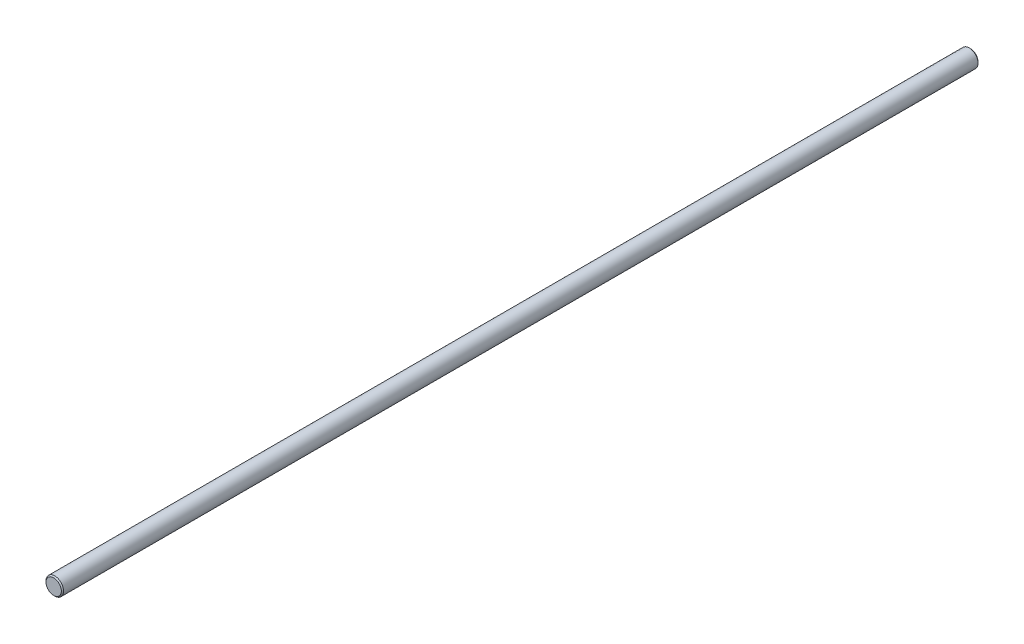
ISO-10303-21;
HEADER;
FILE_DESCRIPTION(('STEP AP214'),'2;1');
FILE_NAME('part.step','',(''),(''),'','','');
FILE_SCHEMA(('AUTOMOTIVE_DESIGN { 1 0 10303 214 1 1 1 1 }'));
ENDSEC;
DATA;
#1=APPLICATION_CONTEXT('core data for automotive mechanical design processes');
#2=APPLICATION_PROTOCOL_DEFINITION('international standard','automotive_design',2000,#1);
#3=PRODUCT_CONTEXT('',#1,'mechanical');
#4=PRODUCT('Part','Part','',(#3));
#5=PRODUCT_RELATED_PRODUCT_CATEGORY('part','',(#4));
#6=PRODUCT_DEFINITION_FORMATION('','',#4);
#7=PRODUCT_DEFINITION_CONTEXT('part definition',#1,'design');
#8=PRODUCT_DEFINITION('design','',#6,#7);
#9=PRODUCT_DEFINITION_SHAPE('','',#8);
#10=(LENGTH_UNIT() NAMED_UNIT(*) SI_UNIT(.MILLI.,.METRE.));
#11=(NAMED_UNIT(*) PLANE_ANGLE_UNIT() SI_UNIT($,.RADIAN.));
#12=(NAMED_UNIT(*) SI_UNIT($,.STERADIAN.) SOLID_ANGLE_UNIT());
#13=UNCERTAINTY_MEASURE_WITH_UNIT(LENGTH_MEASURE(1.E-05),#10,'distance_accuracy_value','');
#14=(GEOMETRIC_REPRESENTATION_CONTEXT(3) GLOBAL_UNCERTAINTY_ASSIGNED_CONTEXT((#13)) GLOBAL_UNIT_ASSIGNED_CONTEXT((#10,
#11,#12)) REPRESENTATION_CONTEXT('',''));
#15=CARTESIAN_POINT('',(0.,0.,0.));
#16=DIRECTION('',(0.,0.,1.));
#17=DIRECTION('',(1.,0.,0.));
#18=AXIS2_PLACEMENT_3D('',#15,#16,#17);
#19=CARTESIAN_POINT('',(0.,0.,417.5));
#20=DIRECTION('',(0.,0.,-1.));
#21=DIRECTION('',(-1.,0.,0.));
#22=AXIS2_PLACEMENT_3D('',#19,#20,#21);
#23=CONICAL_SURFACE('',#22,4.,0.785398163397448);
#24=CARTESIAN_POINT('',(0.,0.,418.));
#25=DIRECTION('',(0.,0.,-1.));
#26=DIRECTION('',(-1.,0.,0.));
#27=AXIS2_PLACEMENT_3D('',#24,#25,#26);
#28=CIRCLE('',#27,3.5);
#29=CARTESIAN_POINT('',(-3.5,0.,418.));
#30=VERTEX_POINT('',#29);
#31=EDGE_CURVE('E42',#30,#30,#28,.T.);
#32=ORIENTED_EDGE('',*,*,#31,.T.);
#33=EDGE_LOOP('',(#32));
#34=FACE_BOUND('',#33,.T.);
#35=CARTESIAN_POINT('',(0.,0.,417.5));
#36=DIRECTION('',(0.,0.,-1.));
#37=DIRECTION('',(-1.,0.,0.));
#38=AXIS2_PLACEMENT_3D('',#35,#36,#37);
#39=CIRCLE('',#38,4.);
#40=CARTESIAN_POINT('',(-4.,0.,417.5));
#41=VERTEX_POINT('',#40);
#42=EDGE_CURVE('E10',#41,#41,#39,.T.);
#43=ORIENTED_EDGE('',*,*,#42,.F.);
#44=EDGE_LOOP('',(#43));
#45=FACE_BOUND('',#44,.T.);
#46=ADVANCED_FACE('F28',(#34,#45),#23,.T.);
#47=CARTESIAN_POINT('',(0.,0.,418.));
#48=DIRECTION('',(0.,0.,-1.));
#49=DIRECTION('',(-1.,0.,0.));
#50=AXIS2_PLACEMENT_3D('',#47,#48,#49);
#51=CYLINDRICAL_SURFACE('',#50,4.);
#52=ORIENTED_EDGE('',*,*,#42,.T.);
#53=EDGE_LOOP('',(#52));
#54=FACE_BOUND('',#53,.T.);
#55=CARTESIAN_POINT('',(0.,0.,0.5));
#56=DIRECTION('',(0.,0.,-1.));
#57=DIRECTION('',(-1.,0.,0.));
#58=AXIS2_PLACEMENT_3D('',#55,#56,#57);
#59=CIRCLE('',#58,4.);
#60=CARTESIAN_POINT('',(-4.,0.,0.5));
#61=VERTEX_POINT('',#60);
#62=EDGE_CURVE('E34',#61,#61,#59,.T.);
#63=ORIENTED_EDGE('',*,*,#62,.F.);
#64=EDGE_LOOP('',(#63));
#65=FACE_BOUND('',#64,.T.);
#66=ADVANCED_FACE('F61',(#54,#65),#51,.T.);
#67=CARTESIAN_POINT('',(0.,0.,0.));
#68=DIRECTION('',(0.,0.,1.));
#69=DIRECTION('',(1.,0.,0.));
#70=AXIS2_PLACEMENT_3D('',#67,#68,#69);
#71=CONICAL_SURFACE('',#70,3.5,0.785398163397448);
#72=ORIENTED_EDGE('',*,*,#62,.T.);
#73=EDGE_LOOP('',(#72));
#74=FACE_BOUND('',#73,.T.);
#75=CARTESIAN_POINT('',(0.,0.,0.));
#76=DIRECTION('',(0.,0.,-1.));
#77=DIRECTION('',(-1.,0.,0.));
#78=AXIS2_PLACEMENT_3D('',#75,#76,#77);
#79=CIRCLE('',#78,3.5);
#80=CARTESIAN_POINT('',(-3.5,0.,0.));
#81=VERTEX_POINT('',#80);
#82=EDGE_CURVE('E38',#81,#81,#79,.T.);
#83=ORIENTED_EDGE('',*,*,#82,.F.);
#84=EDGE_LOOP('',(#83));
#85=FACE_BOUND('',#84,.T.);
#86=ADVANCED_FACE('F57',(#74,#85),#71,.T.);
#87=CARTESIAN_POINT('',(0.,0.,0.));
#88=DIRECTION('',(0.,0.,-1.));
#89=DIRECTION('',(-1.,0.,0.));
#90=AXIS2_PLACEMENT_3D('',#87,#88,#89);
#91=PLANE('',#90);
#92=ORIENTED_EDGE('',*,*,#82,.T.);
#93=EDGE_LOOP('',(#92));
#94=FACE_BOUND('',#93,.T.);
#95=ADVANCED_FACE('F52',(#94),#91,.T.);
#96=CARTESIAN_POINT('',(3.5,0.,418.));
#97=DIRECTION('',(0.,0.,1.));
#98=DIRECTION('',(1.,0.,0.));
#99=AXIS2_PLACEMENT_3D('',#96,#97,#98);
#100=PLANE('',#99);
#101=ORIENTED_EDGE('',*,*,#31,.F.);
#102=EDGE_LOOP('',(#101));
#103=FACE_BOUND('',#102,.T.);
#104=ADVANCED_FACE('F50',(#103),#100,.T.);
#105=CLOSED_SHELL('',(#46,#66,#86,#95,#104));
#106=MANIFOLD_SOLID_BREP('B2',#105);
#107=ADVANCED_BREP_SHAPE_REPRESENTATION('',(#18,#106),#14);
#108=SHAPE_DEFINITION_REPRESENTATION(#9,#107);
ENDSEC;
END-ISO-10303-21;
